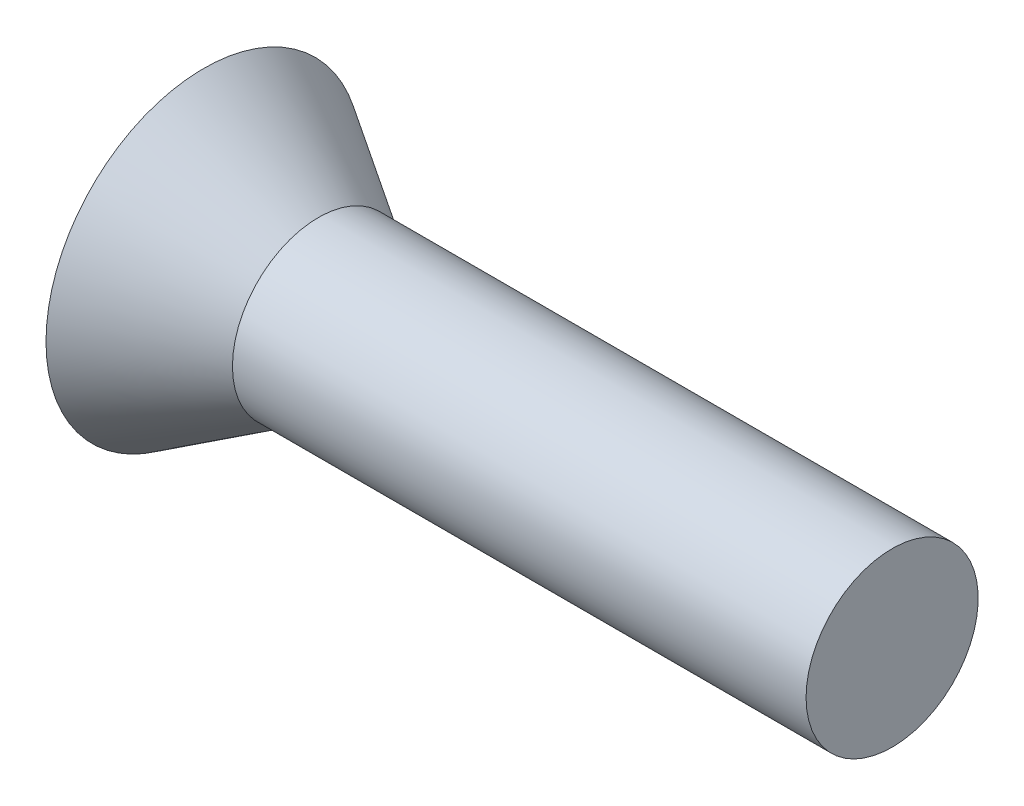
ISO-10303-21;
HEADER;
FILE_DESCRIPTION(('STEP AP214'),'2;1');
FILE_NAME('part.step','',(''),(''),'','','');
FILE_SCHEMA(('AUTOMOTIVE_DESIGN { 1 0 10303 214 1 1 1 1 }'));
ENDSEC;
DATA;
#1=APPLICATION_CONTEXT('core data for automotive mechanical design processes');
#2=APPLICATION_PROTOCOL_DEFINITION('international standard','automotive_design',2000,#1);
#3=PRODUCT_CONTEXT('',#1,'mechanical');
#4=PRODUCT('Part','Part','',(#3));
#5=PRODUCT_RELATED_PRODUCT_CATEGORY('part','',(#4));
#6=PRODUCT_DEFINITION_FORMATION('','',#4);
#7=PRODUCT_DEFINITION_CONTEXT('part definition',#1,'design');
#8=PRODUCT_DEFINITION('design','',#6,#7);
#9=PRODUCT_DEFINITION_SHAPE('','',#8);
#10=(LENGTH_UNIT() NAMED_UNIT(*) SI_UNIT(.MILLI.,.METRE.));
#11=(NAMED_UNIT(*) PLANE_ANGLE_UNIT() SI_UNIT($,.RADIAN.));
#12=(NAMED_UNIT(*) SI_UNIT($,.STERADIAN.) SOLID_ANGLE_UNIT());
#13=UNCERTAINTY_MEASURE_WITH_UNIT(LENGTH_MEASURE(1.E-05),#10,'distance_accuracy_value','');
#14=(GEOMETRIC_REPRESENTATION_CONTEXT(3) GLOBAL_UNCERTAINTY_ASSIGNED_CONTEXT((#13)) GLOBAL_UNIT_ASSIGNED_CONTEXT((#10,
#11,#12)) REPRESENTATION_CONTEXT('',''));
#15=CARTESIAN_POINT('',(0.,0.,0.));
#16=DIRECTION('',(0.,0.,1.));
#17=DIRECTION('',(1.,0.,0.));
#18=AXIS2_PLACEMENT_3D('',#15,#16,#17);
#19=CARTESIAN_POINT('',(0.,0.,0.));
#20=DIRECTION('',(1.,0.,0.));
#21=DIRECTION('',(0.,0.,-1.));
#22=AXIS2_PLACEMENT_3D('',#19,#20,#21);
#23=PLANE('',#22);
#24=DIRECTION('',(0.,0.,1.));
#25=VECTOR('',#24,1.);
#26=CARTESIAN_POINT('',(0.,-0.25,-0.250000000000001));
#27=LINE('',#26,#25);
#28=CARTESIAN_POINT('',(0.,-0.25,-1.25));
#29=VERTEX_POINT('',#28);
#30=CARTESIAN_POINT('',(0.,-0.25,-0.250000000000001));
#31=VERTEX_POINT('',#30);
#32=EDGE_CURVE('E160',#29,#31,#27,.T.);
#33=ORIENTED_EDGE('',*,*,#32,.F.);
#34=DIRECTION('',(0.,-1.,0.));
#35=VECTOR('',#34,1.);
#36=CARTESIAN_POINT('',(0.,-0.25,-1.25));
#37=LINE('',#36,#35);
#38=CARTESIAN_POINT('',(0.,0.25,-1.25));
#39=VERTEX_POINT('',#38);
#40=EDGE_CURVE('E50',#39,#29,#37,.T.);
#41=ORIENTED_EDGE('',*,*,#40,.F.);
#42=DIRECTION('',(0.,0.,-1.));
#43=VECTOR('',#42,1.);
#44=CARTESIAN_POINT('',(0.,0.25,-0.25));
#45=LINE('',#44,#43);
#46=CARTESIAN_POINT('',(0.,0.25,-0.25));
#47=VERTEX_POINT('',#46);
#48=EDGE_CURVE('E187',#47,#39,#45,.T.);
#49=ORIENTED_EDGE('',*,*,#48,.F.);
#50=DIRECTION('',(0.,-1.,0.));
#51=VECTOR('',#50,1.);
#52=CARTESIAN_POINT('',(0.,0.25,-0.25));
#53=LINE('',#52,#51);
#54=CARTESIAN_POINT('',(0.,1.25,-0.25));
#55=VERTEX_POINT('',#54);
#56=EDGE_CURVE('E185',#55,#47,#53,.T.);
#57=ORIENTED_EDGE('',*,*,#56,.F.);
#58=DIRECTION('',(0.,0.,-1.));
#59=VECTOR('',#58,1.);
#60=CARTESIAN_POINT('',(0.,1.25,0.25));
#61=LINE('',#60,#59);
#62=CARTESIAN_POINT('',(0.,1.25,0.25));
#63=VERTEX_POINT('',#62);
#64=EDGE_CURVE('E134',#63,#55,#61,.T.);
#65=ORIENTED_EDGE('',*,*,#64,.F.);
#66=DIRECTION('',(0.,1.,0.));
#67=VECTOR('',#66,1.);
#68=CARTESIAN_POINT('',(0.,0.25,0.25));
#69=LINE('',#68,#67);
#70=CARTESIAN_POINT('',(0.,0.25,0.25));
#71=VERTEX_POINT('',#70);
#72=EDGE_CURVE('E181',#71,#63,#69,.T.);
#73=ORIENTED_EDGE('',*,*,#72,.F.);
#74=DIRECTION('',(0.,0.,-1.));
#75=VECTOR('',#74,1.);
#76=CARTESIAN_POINT('',(0.,0.25,1.25));
#77=LINE('',#76,#75);
#78=CARTESIAN_POINT('',(0.,0.25,1.25));
#79=VERTEX_POINT('',#78);
#80=EDGE_CURVE('E178',#79,#71,#77,.T.);
#81=ORIENTED_EDGE('',*,*,#80,.F.);
#82=DIRECTION('',(0.,1.,0.));
#83=VECTOR('',#82,1.);
#84=CARTESIAN_POINT('',(0.,-0.25,1.25));
#85=LINE('',#84,#83);
#86=CARTESIAN_POINT('',(0.,-0.25,1.25));
#87=VERTEX_POINT('',#86);
#88=EDGE_CURVE('E175',#87,#79,#85,.T.);
#89=ORIENTED_EDGE('',*,*,#88,.F.);
#90=DIRECTION('',(0.,0.,1.));
#91=VECTOR('',#90,1.);
#92=CARTESIAN_POINT('',(0.,-0.25,1.25));
#93=LINE('',#92,#91);
#94=CARTESIAN_POINT('',(0.,-0.25,0.25));
#95=VERTEX_POINT('',#94);
#96=EDGE_CURVE('E172',#95,#87,#93,.T.);
#97=ORIENTED_EDGE('',*,*,#96,.F.);
#98=DIRECTION('',(0.,1.,0.));
#99=VECTOR('',#98,1.);
#100=CARTESIAN_POINT('',(0.,-1.25,0.25));
#101=LINE('',#100,#99);
#102=CARTESIAN_POINT('',(0.,-1.25,0.25));
#103=VERTEX_POINT('',#102);
#104=EDGE_CURVE('E169',#103,#95,#101,.T.);
#105=ORIENTED_EDGE('',*,*,#104,.F.);
#106=DIRECTION('',(0.,0.,1.));
#107=VECTOR('',#106,1.);
#108=CARTESIAN_POINT('',(0.,-1.25,0.25));
#109=LINE('',#108,#107);
#110=CARTESIAN_POINT('',(0.,-1.25,-0.25));
#111=VERTEX_POINT('',#110);
#112=EDGE_CURVE('E166',#111,#103,#109,.T.);
#113=ORIENTED_EDGE('',*,*,#112,.F.);
#114=DIRECTION('',(0.,-1.,0.));
#115=VECTOR('',#114,1.);
#116=CARTESIAN_POINT('',(0.,-1.25,-0.25));
#117=LINE('',#116,#115);
#118=EDGE_CURVE('E163',#31,#111,#117,.T.);
#119=ORIENTED_EDGE('',*,*,#118,.F.);
#120=EDGE_LOOP('',(#33,#41,#49,#57,#65,#73,#81,#89,#97,#105,#113,#119));
#121=FACE_BOUND('',#120,.T.);
#122=CARTESIAN_POINT('',(0.,0.,0.));
#123=DIRECTION('',(-1.,0.,0.));
#124=DIRECTION('',(0.,0.,1.));
#125=AXIS2_PLACEMENT_3D('',#122,#123,#124);
#126=CIRCLE('',#125,2.75);
#127=CARTESIAN_POINT('',(0.,0.,2.75));
#128=VERTEX_POINT('',#127);
#129=EDGE_CURVE('E11',#128,#128,#126,.T.);
#130=ORIENTED_EDGE('',*,*,#129,.T.);
#131=EDGE_LOOP('',(#130));
#132=FACE_BOUND('',#131,.T.);
#133=ADVANCED_FACE('F36',(#121,#132),#23,.F.);
#134=CARTESIAN_POINT('',(2.,0.,0.));
#135=DIRECTION('',(-1.,0.,0.));
#136=DIRECTION('',(0.,0.,1.));
#137=AXIS2_PLACEMENT_3D('',#134,#135,#136);
#138=CONICAL_SURFACE('',#137,1.5,0.558599315343562);
#139=ORIENTED_EDGE('',*,*,#129,.F.);
#140=EDGE_LOOP('',(#139));
#141=FACE_BOUND('',#140,.T.);
#142=CARTESIAN_POINT('',(2.,0.,0.));
#143=DIRECTION('',(-1.,0.,0.));
#144=DIRECTION('',(0.,0.,1.));
#145=AXIS2_PLACEMENT_3D('',#142,#143,#144);
#146=CIRCLE('',#145,1.5);
#147=CARTESIAN_POINT('',(2.,0.,1.5));
#148=VERTEX_POINT('',#147);
#149=EDGE_CURVE('E43',#148,#148,#146,.T.);
#150=ORIENTED_EDGE('',*,*,#149,.T.);
#151=EDGE_LOOP('',(#150));
#152=FACE_BOUND('',#151,.T.);
#153=ADVANCED_FACE('F213',(#141,#152),#138,.T.);
#154=CARTESIAN_POINT('',(-2.10352941176471,0.,0.));
#155=DIRECTION('',(-1.,0.,0.));
#156=DIRECTION('',(0.,0.,1.));
#157=AXIS2_PLACEMENT_3D('',#154,#155,#156);
#158=CYLINDRICAL_SURFACE('',#157,1.5);
#159=ORIENTED_EDGE('',*,*,#149,.F.);
#160=EDGE_LOOP('',(#159));
#161=FACE_BOUND('',#160,.T.);
#162=CARTESIAN_POINT('',(12.,0.,0.));
#163=DIRECTION('',(-1.,0.,0.));
#164=DIRECTION('',(0.,0.,1.));
#165=AXIS2_PLACEMENT_3D('',#162,#163,#164);
#166=CIRCLE('',#165,1.5);
#167=CARTESIAN_POINT('',(12.,0.,1.5));
#168=VERTEX_POINT('',#167);
#169=EDGE_CURVE('E191',#168,#168,#166,.T.);
#170=ORIENTED_EDGE('',*,*,#169,.T.);
#171=EDGE_LOOP('',(#170));
#172=FACE_BOUND('',#171,.T.);
#173=ADVANCED_FACE('F215',(#161,#172),#158,.T.);
#174=CARTESIAN_POINT('',(12.,0.,-1.5));
#175=DIRECTION('',(-1.,0.,0.));
#176=DIRECTION('',(0.,0.,1.));
#177=AXIS2_PLACEMENT_3D('',#174,#175,#176);
#178=PLANE('',#177);
#179=ORIENTED_EDGE('',*,*,#169,.F.);
#180=EDGE_LOOP('',(#179));
#181=FACE_BOUND('',#180,.T.);
#182=ADVANCED_FACE('F218',(#181),#178,.F.);
#183=CARTESIAN_POINT('',(1.,-0.25,-1.25));
#184=DIRECTION('',(0.,0.,-1.));
#185=DIRECTION('',(-1.,0.,0.));
#186=AXIS2_PLACEMENT_3D('',#183,#184,#185);
#187=PLANE('',#186);
#188=ORIENTED_EDGE('',*,*,#40,.T.);
#189=DIRECTION('',(-1.,0.,0.));
#190=VECTOR('',#189,1.);
#191=CARTESIAN_POINT('',(1.,-0.25,-1.25));
#192=LINE('',#191,#190);
#193=CARTESIAN_POINT('',(1.,-0.25,-1.25));
#194=VERTEX_POINT('',#193);
#195=EDGE_CURVE('E98',#194,#29,#192,.T.);
#196=ORIENTED_EDGE('',*,*,#195,.F.);
#197=DIRECTION('',(0.,-1.,0.));
#198=VECTOR('',#197,1.);
#199=CARTESIAN_POINT('',(1.,-0.25,-1.25));
#200=LINE('',#199,#198);
#201=CARTESIAN_POINT('',(1.,0.25,-1.25));
#202=VERTEX_POINT('',#201);
#203=EDGE_CURVE('E189',#202,#194,#200,.T.);
#204=ORIENTED_EDGE('',*,*,#203,.F.);
#205=DIRECTION('',(-1.,0.,0.));
#206=VECTOR('',#205,1.);
#207=CARTESIAN_POINT('',(1.,0.25,-1.25));
#208=LINE('',#207,#206);
#209=EDGE_CURVE('E58',#202,#39,#208,.T.);
#210=ORIENTED_EDGE('',*,*,#209,.T.);
#211=EDGE_LOOP('',(#188,#196,#204,#210));
#212=FACE_BOUND('',#211,.T.);
#213=ADVANCED_FACE('F223',(#212),#187,.F.);
#214=CARTESIAN_POINT('',(1.,0.25,-0.25));
#215=DIRECTION('',(0.,1.,0.));
#216=DIRECTION('',(0.,0.,1.));
#217=AXIS2_PLACEMENT_3D('',#214,#215,#216);
#218=PLANE('',#217);
#219=ORIENTED_EDGE('',*,*,#48,.T.);
#220=ORIENTED_EDGE('',*,*,#209,.F.);
#221=DIRECTION('',(0.,0.,-1.));
#222=VECTOR('',#221,1.);
#223=CARTESIAN_POINT('',(1.,0.25,-0.25));
#224=LINE('',#223,#222);
#225=CARTESIAN_POINT('',(1.,0.25,-0.25));
#226=VERTEX_POINT('',#225);
#227=EDGE_CURVE('E146',#226,#202,#224,.T.);
#228=ORIENTED_EDGE('',*,*,#227,.F.);
#229=DIRECTION('',(-1.,0.,0.));
#230=VECTOR('',#229,1.);
#231=CARTESIAN_POINT('',(1.,0.25,-0.25));
#232=LINE('',#231,#230);
#233=EDGE_CURVE('E138',#226,#47,#232,.T.);
#234=ORIENTED_EDGE('',*,*,#233,.T.);
#235=EDGE_LOOP('',(#219,#220,#228,#234));
#236=FACE_BOUND('',#235,.T.);
#237=ADVANCED_FACE('F228',(#236),#218,.F.);
#238=CARTESIAN_POINT('',(1.,0.25,-0.25));
#239=DIRECTION('',(0.,0.,-1.));
#240=DIRECTION('',(-1.,0.,0.));
#241=AXIS2_PLACEMENT_3D('',#238,#239,#240);
#242=PLANE('',#241);
#243=ORIENTED_EDGE('',*,*,#56,.T.);
#244=ORIENTED_EDGE('',*,*,#233,.F.);
#245=DIRECTION('',(0.,-1.,0.));
#246=VECTOR('',#245,1.);
#247=CARTESIAN_POINT('',(1.,0.25,-0.25));
#248=LINE('',#247,#246);
#249=CARTESIAN_POINT('',(1.,1.25,-0.25));
#250=VERTEX_POINT('',#249);
#251=EDGE_CURVE('E142',#250,#226,#248,.T.);
#252=ORIENTED_EDGE('',*,*,#251,.F.);
#253=DIRECTION('',(-1.,0.,0.));
#254=VECTOR('',#253,1.);
#255=CARTESIAN_POINT('',(1.,1.25,-0.25));
#256=LINE('',#255,#254);
#257=EDGE_CURVE('E127',#250,#55,#256,.T.);
#258=ORIENTED_EDGE('',*,*,#257,.T.);
#259=EDGE_LOOP('',(#243,#244,#252,#258));
#260=FACE_BOUND('',#259,.T.);
#261=ADVANCED_FACE('F143',(#260),#242,.F.);
#262=CARTESIAN_POINT('',(1.,1.25,0.25));
#263=DIRECTION('',(0.,1.,0.));
#264=DIRECTION('',(0.,0.,1.));
#265=AXIS2_PLACEMENT_3D('',#262,#263,#264);
#266=PLANE('',#265);
#267=ORIENTED_EDGE('',*,*,#64,.T.);
#268=ORIENTED_EDGE('',*,*,#257,.F.);
#269=DIRECTION('',(0.,0.,-1.));
#270=VECTOR('',#269,1.);
#271=CARTESIAN_POINT('',(1.,1.25,0.25));
#272=LINE('',#271,#270);
#273=CARTESIAN_POINT('',(1.,1.25,0.25));
#274=VERTEX_POINT('',#273);
#275=EDGE_CURVE('E131',#274,#250,#272,.T.);
#276=ORIENTED_EDGE('',*,*,#275,.F.);
#277=DIRECTION('',(-1.,0.,0.));
#278=VECTOR('',#277,1.);
#279=CARTESIAN_POINT('',(1.,1.25,0.25));
#280=LINE('',#279,#278);
#281=EDGE_CURVE('E139',#274,#63,#280,.T.);
#282=ORIENTED_EDGE('',*,*,#281,.T.);
#283=EDGE_LOOP('',(#267,#268,#276,#282));
#284=FACE_BOUND('',#283,.T.);
#285=ADVANCED_FACE('F129',(#284),#266,.F.);
#286=CARTESIAN_POINT('',(1.,0.25,0.25));
#287=DIRECTION('',(0.,0.,1.));
#288=DIRECTION('',(0.,-1.,0.));
#289=AXIS2_PLACEMENT_3D('',#286,#287,#288);
#290=PLANE('',#289);
#291=ORIENTED_EDGE('',*,*,#72,.T.);
#292=ORIENTED_EDGE('',*,*,#281,.F.);
#293=DIRECTION('',(0.,1.,0.));
#294=VECTOR('',#293,1.);
#295=CARTESIAN_POINT('',(1.,0.25,0.25));
#296=LINE('',#295,#294);
#297=CARTESIAN_POINT('',(1.,0.25,0.25));
#298=VERTEX_POINT('',#297);
#299=EDGE_CURVE('E152',#298,#274,#296,.T.);
#300=ORIENTED_EDGE('',*,*,#299,.F.);
#301=DIRECTION('',(-1.,0.,0.));
#302=VECTOR('',#301,1.);
#303=CARTESIAN_POINT('',(1.,0.25,0.25));
#304=LINE('',#303,#302);
#305=EDGE_CURVE('E194',#298,#71,#304,.T.);
#306=ORIENTED_EDGE('',*,*,#305,.T.);
#307=EDGE_LOOP('',(#291,#292,#300,#306));
#308=FACE_BOUND('',#307,.T.);
#309=ADVANCED_FACE('F271',(#308),#290,.F.);
#310=CARTESIAN_POINT('',(1.,0.25,1.25));
#311=DIRECTION('',(0.,1.,0.));
#312=DIRECTION('',(0.,0.,1.));
#313=AXIS2_PLACEMENT_3D('',#310,#311,#312);
#314=PLANE('',#313);
#315=ORIENTED_EDGE('',*,*,#80,.T.);
#316=ORIENTED_EDGE('',*,*,#305,.F.);
#317=DIRECTION('',(0.,0.,-1.));
#318=VECTOR('',#317,1.);
#319=CARTESIAN_POINT('',(1.,0.25,1.25));
#320=LINE('',#319,#318);
#321=CARTESIAN_POINT('',(1.,0.25,1.25));
#322=VERTEX_POINT('',#321);
#323=EDGE_CURVE('E154',#322,#298,#320,.T.);
#324=ORIENTED_EDGE('',*,*,#323,.F.);
#325=DIRECTION('',(-1.,0.,0.));
#326=VECTOR('',#325,1.);
#327=CARTESIAN_POINT('',(1.,0.25,1.25));
#328=LINE('',#327,#326);
#329=EDGE_CURVE('E196',#322,#79,#328,.T.);
#330=ORIENTED_EDGE('',*,*,#329,.T.);
#331=EDGE_LOOP('',(#315,#316,#324,#330));
#332=FACE_BOUND('',#331,.T.);
#333=ADVANCED_FACE('F267',(#332),#314,.F.);
#334=CARTESIAN_POINT('',(1.,-0.25,1.25));
#335=DIRECTION('',(0.,0.,1.));
#336=DIRECTION('',(1.,0.,0.));
#337=AXIS2_PLACEMENT_3D('',#334,#335,#336);
#338=PLANE('',#337);
#339=ORIENTED_EDGE('',*,*,#88,.T.);
#340=ORIENTED_EDGE('',*,*,#329,.F.);
#341=DIRECTION('',(0.,1.,0.));
#342=VECTOR('',#341,1.);
#343=CARTESIAN_POINT('',(1.,-0.25,1.25));
#344=LINE('',#343,#342);
#345=CARTESIAN_POINT('',(1.,-0.25,1.25));
#346=VERTEX_POINT('',#345);
#347=EDGE_CURVE('E262',#346,#322,#344,.T.);
#348=ORIENTED_EDGE('',*,*,#347,.F.);
#349=DIRECTION('',(-1.,0.,0.));
#350=VECTOR('',#349,1.);
#351=CARTESIAN_POINT('',(1.,-0.25,1.25));
#352=LINE('',#351,#350);
#353=EDGE_CURVE('E198',#346,#87,#352,.T.);
#354=ORIENTED_EDGE('',*,*,#353,.T.);
#355=EDGE_LOOP('',(#339,#340,#348,#354));
#356=FACE_BOUND('',#355,.T.);
#357=ADVANCED_FACE('F286',(#356),#338,.F.);
#358=CARTESIAN_POINT('',(1.,-0.25,1.25));
#359=DIRECTION('',(0.,-1.,0.));
#360=DIRECTION('',(0.,0.,-1.));
#361=AXIS2_PLACEMENT_3D('',#358,#359,#360);
#362=PLANE('',#361);
#363=ORIENTED_EDGE('',*,*,#96,.T.);
#364=ORIENTED_EDGE('',*,*,#353,.F.);
#365=DIRECTION('',(0.,0.,1.));
#366=VECTOR('',#365,1.);
#367=CARTESIAN_POINT('',(1.,-0.25,1.25));
#368=LINE('',#367,#366);
#369=CARTESIAN_POINT('',(1.,-0.25,0.25));
#370=VERTEX_POINT('',#369);
#371=EDGE_CURVE('E259',#370,#346,#368,.T.);
#372=ORIENTED_EDGE('',*,*,#371,.F.);
#373=DIRECTION('',(-1.,0.,0.));
#374=VECTOR('',#373,1.);
#375=CARTESIAN_POINT('',(1.,-0.25,0.25));
#376=LINE('',#375,#374);
#377=EDGE_CURVE('E200',#370,#95,#376,.T.);
#378=ORIENTED_EDGE('',*,*,#377,.T.);
#379=EDGE_LOOP('',(#363,#364,#372,#378));
#380=FACE_BOUND('',#379,.T.);
#381=ADVANCED_FACE('F289',(#380),#362,.F.);
#382=CARTESIAN_POINT('',(1.,-1.25,0.25));
#383=DIRECTION('',(0.,0.,1.));
#384=DIRECTION('',(0.,-1.,0.));
#385=AXIS2_PLACEMENT_3D('',#382,#383,#384);
#386=PLANE('',#385);
#387=ORIENTED_EDGE('',*,*,#104,.T.);
#388=ORIENTED_EDGE('',*,*,#377,.F.);
#389=DIRECTION('',(0.,1.,0.));
#390=VECTOR('',#389,1.);
#391=CARTESIAN_POINT('',(1.,-1.25,0.25));
#392=LINE('',#391,#390);
#393=CARTESIAN_POINT('',(1.,-1.25,0.25));
#394=VERTEX_POINT('',#393);
#395=EDGE_CURVE('E256',#394,#370,#392,.T.);
#396=ORIENTED_EDGE('',*,*,#395,.F.);
#397=DIRECTION('',(-1.,0.,0.));
#398=VECTOR('',#397,1.);
#399=CARTESIAN_POINT('',(1.,-1.25,0.25));
#400=LINE('',#399,#398);
#401=EDGE_CURVE('E202',#394,#103,#400,.T.);
#402=ORIENTED_EDGE('',*,*,#401,.T.);
#403=EDGE_LOOP('',(#387,#388,#396,#402));
#404=FACE_BOUND('',#403,.T.);
#405=ADVANCED_FACE('F293',(#404),#386,.F.);
#406=CARTESIAN_POINT('',(1.,-1.25,0.25));
#407=DIRECTION('',(0.,-1.,0.));
#408=DIRECTION('',(0.,0.,-1.));
#409=AXIS2_PLACEMENT_3D('',#406,#407,#408);
#410=PLANE('',#409);
#411=ORIENTED_EDGE('',*,*,#112,.T.);
#412=ORIENTED_EDGE('',*,*,#401,.F.);
#413=DIRECTION('',(0.,0.,1.));
#414=VECTOR('',#413,1.);
#415=CARTESIAN_POINT('',(1.,-1.25,0.25));
#416=LINE('',#415,#414);
#417=CARTESIAN_POINT('',(1.,-1.25,-0.25));
#418=VERTEX_POINT('',#417);
#419=EDGE_CURVE('E253',#418,#394,#416,.T.);
#420=ORIENTED_EDGE('',*,*,#419,.F.);
#421=DIRECTION('',(-1.,0.,0.));
#422=VECTOR('',#421,1.);
#423=CARTESIAN_POINT('',(1.,-1.25,-0.25));
#424=LINE('',#423,#422);
#425=EDGE_CURVE('E204',#418,#111,#424,.T.);
#426=ORIENTED_EDGE('',*,*,#425,.T.);
#427=EDGE_LOOP('',(#411,#412,#420,#426));
#428=FACE_BOUND('',#427,.T.);
#429=ADVANCED_FACE('F297',(#428),#410,.F.);
#430=CARTESIAN_POINT('',(1.,-1.25,-0.25));
#431=DIRECTION('',(0.,0.,-1.));
#432=DIRECTION('',(0.,1.,0.));
#433=AXIS2_PLACEMENT_3D('',#430,#431,#432);
#434=PLANE('',#433);
#435=ORIENTED_EDGE('',*,*,#118,.T.);
#436=ORIENTED_EDGE('',*,*,#425,.F.);
#437=DIRECTION('',(0.,-1.,0.));
#438=VECTOR('',#437,1.);
#439=CARTESIAN_POINT('',(1.,-1.25,-0.25));
#440=LINE('',#439,#438);
#441=CARTESIAN_POINT('',(1.,-0.25,-0.250000000000001));
#442=VERTEX_POINT('',#441);
#443=EDGE_CURVE('E248',#442,#418,#440,.T.);
#444=ORIENTED_EDGE('',*,*,#443,.F.);
#445=DIRECTION('',(-1.,0.,0.));
#446=VECTOR('',#445,1.);
#447=CARTESIAN_POINT('',(1.,-0.25,-0.250000000000001));
#448=LINE('',#447,#446);
#449=EDGE_CURVE('E206',#442,#31,#448,.T.);
#450=ORIENTED_EDGE('',*,*,#449,.T.);
#451=EDGE_LOOP('',(#435,#436,#444,#450));
#452=FACE_BOUND('',#451,.T.);
#453=ADVANCED_FACE('F301',(#452),#434,.F.);
#454=CARTESIAN_POINT('',(1.,-0.25,-0.250000000000001));
#455=DIRECTION('',(0.,-1.,0.));
#456=DIRECTION('',(0.,0.,-1.));
#457=AXIS2_PLACEMENT_3D('',#454,#455,#456);
#458=PLANE('',#457);
#459=ORIENTED_EDGE('',*,*,#32,.T.);
#460=ORIENTED_EDGE('',*,*,#449,.F.);
#461=DIRECTION('',(0.,0.,1.));
#462=VECTOR('',#461,1.);
#463=CARTESIAN_POINT('',(1.,-0.25,-0.250000000000001));
#464=LINE('',#463,#462);
#465=EDGE_CURVE('E246',#194,#442,#464,.T.);
#466=ORIENTED_EDGE('',*,*,#465,.F.);
#467=ORIENTED_EDGE('',*,*,#195,.T.);
#468=EDGE_LOOP('',(#459,#460,#466,#467));
#469=FACE_BOUND('',#468,.T.);
#470=ADVANCED_FACE('F243',(#469),#458,.F.);
#471=CARTESIAN_POINT('',(1.,0.,0.));
#472=DIRECTION('',(-1.,0.,0.));
#473=DIRECTION('',(0.,0.,1.));
#474=AXIS2_PLACEMENT_3D('',#471,#472,#473);
#475=PLANE('',#474);
#476=ORIENTED_EDGE('',*,*,#203,.T.);
#477=ORIENTED_EDGE('',*,*,#465,.T.);
#478=ORIENTED_EDGE('',*,*,#443,.T.);
#479=ORIENTED_EDGE('',*,*,#419,.T.);
#480=ORIENTED_EDGE('',*,*,#395,.T.);
#481=ORIENTED_EDGE('',*,*,#371,.T.);
#482=ORIENTED_EDGE('',*,*,#347,.T.);
#483=ORIENTED_EDGE('',*,*,#323,.T.);
#484=ORIENTED_EDGE('',*,*,#299,.T.);
#485=ORIENTED_EDGE('',*,*,#275,.T.);
#486=ORIENTED_EDGE('',*,*,#251,.T.);
#487=ORIENTED_EDGE('',*,*,#227,.T.);
#488=EDGE_LOOP('',(#476,#477,#478,#479,#480,#481,#482,#483,#484,#485,#486,#487));
#489=FACE_BOUND('',#488,.T.);
#490=ADVANCED_FACE('F149',(#489),#475,.T.);
#491=CLOSED_SHELL('',(#133,#153,#173,#182,#213,#237,#261,#285,#309,#333,#357,#381,#405,#429,
#453,#470,#490));
#492=MANIFOLD_SOLID_BREP('B2',#491);
#493=ADVANCED_BREP_SHAPE_REPRESENTATION('',(#18,#492),#14);
#494=SHAPE_DEFINITION_REPRESENTATION(#9,#493);
ENDSEC;
END-ISO-10303-21;
